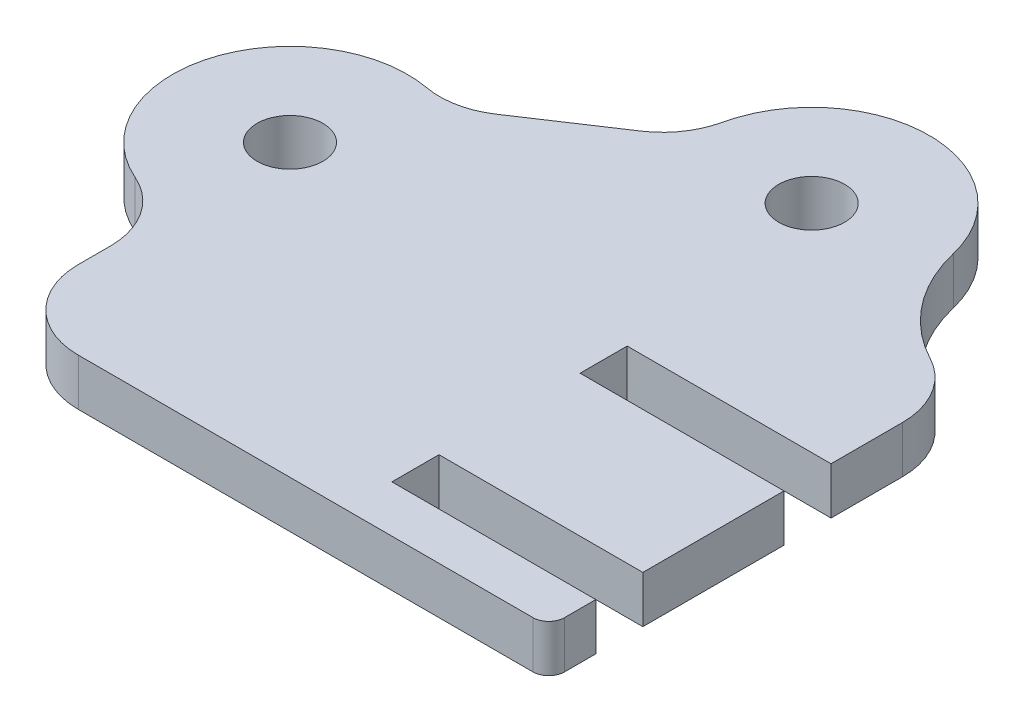
ISO-10303-21;
HEADER;
FILE_DESCRIPTION(('STEP AP214'),'2;1');
FILE_NAME('part.step','',(''),(''),'','','');
FILE_SCHEMA(('AUTOMOTIVE_DESIGN { 1 0 10303 214 1 1 1 1 }'));
ENDSEC;
DATA;
#1=APPLICATION_CONTEXT('core data for automotive mechanical design processes');
#2=APPLICATION_PROTOCOL_DEFINITION('international standard','automotive_design',2000,#1);
#3=PRODUCT_CONTEXT('',#1,'mechanical');
#4=PRODUCT('Part','Part','',(#3));
#5=PRODUCT_RELATED_PRODUCT_CATEGORY('part','',(#4));
#6=PRODUCT_DEFINITION_FORMATION('','',#4);
#7=PRODUCT_DEFINITION_CONTEXT('part definition',#1,'design');
#8=PRODUCT_DEFINITION('design','',#6,#7);
#9=PRODUCT_DEFINITION_SHAPE('','',#8);
#10=(LENGTH_UNIT() NAMED_UNIT(*) SI_UNIT(.MILLI.,.METRE.));
#11=(NAMED_UNIT(*) PLANE_ANGLE_UNIT() SI_UNIT($,.RADIAN.));
#12=(NAMED_UNIT(*) SI_UNIT($,.STERADIAN.) SOLID_ANGLE_UNIT());
#13=UNCERTAINTY_MEASURE_WITH_UNIT(LENGTH_MEASURE(1.E-05),#10,'distance_accuracy_value','');
#14=(GEOMETRIC_REPRESENTATION_CONTEXT(3) GLOBAL_UNCERTAINTY_ASSIGNED_CONTEXT((#13)) GLOBAL_UNIT_ASSIGNED_CONTEXT((#10,
#11,#12)) REPRESENTATION_CONTEXT('',''));
#15=CARTESIAN_POINT('',(0.,0.,0.));
#16=DIRECTION('',(0.,0.,1.));
#17=DIRECTION('',(1.,0.,0.));
#18=AXIS2_PLACEMENT_3D('',#15,#16,#17);
#19=CARTESIAN_POINT('',(2.25395930317418,3.,-12.2951074602719));
#20=DIRECTION('',(0.,-1.,0.));
#21=DIRECTION('',(0.,0.,-1.));
#22=AXIS2_PLACEMENT_3D('',#19,#20,#21);
#23=PLANE('',#22);
#24=DIRECTION('',(1.,0.,0.));
#25=VECTOR('',#24,1.);
#26=CARTESIAN_POINT('',(0.,3.,18.5));
#27=LINE('',#26,#25);
#28=CARTESIAN_POINT('',(5.,3.,18.5));
#29=VERTEX_POINT('',#28);
#30=CARTESIAN_POINT('',(34.,3.,18.5));
#31=VERTEX_POINT('',#30);
#32=EDGE_CURVE('E277',#29,#31,#27,.T.);
#33=ORIENTED_EDGE('',*,*,#32,.T.);
#34=CARTESIAN_POINT('',(34.,3.,17.5));
#35=DIRECTION('',(0.,-1.,0.));
#36=DIRECTION('',(0.,0.,-1.));
#37=AXIS2_PLACEMENT_3D('',#34,#35,#36);
#38=CIRCLE('',#37,1.);
#39=CARTESIAN_POINT('',(35.,3.,17.5));
#40=VERTEX_POINT('',#39);
#41=EDGE_CURVE('E56',#31,#40,#38,.F.);
#42=ORIENTED_EDGE('',*,*,#41,.T.);
#43=DIRECTION('',(0.,0.,-1.));
#44=VECTOR('',#43,1.);
#45=CARTESIAN_POINT('',(35.,3.,15.5));
#46=LINE('',#45,#44);
#47=CARTESIAN_POINT('',(35.,3.,15.5));
#48=VERTEX_POINT('',#47);
#49=EDGE_CURVE('E203',#40,#48,#46,.T.);
#50=ORIENTED_EDGE('',*,*,#49,.T.);
#51=DIRECTION('',(1.,0.,0.));
#52=VECTOR('',#51,1.);
#53=CARTESIAN_POINT('',(30.,3.,15.5));
#54=LINE('',#53,#52);
#55=CARTESIAN_POINT('',(22.,3.,15.5));
#56=VERTEX_POINT('',#55);
#57=EDGE_CURVE('E236',#56,#48,#54,.T.);
#58=ORIENTED_EDGE('',*,*,#57,.F.);
#59=DIRECTION('',(0.,0.,1.));
#60=VECTOR('',#59,1.);
#61=CARTESIAN_POINT('',(22.,3.,12.5));
#62=LINE('',#61,#60);
#63=CARTESIAN_POINT('',(22.,3.,12.5));
#64=VERTEX_POINT('',#63);
#65=EDGE_CURVE('E245',#64,#56,#62,.T.);
#66=ORIENTED_EDGE('',*,*,#65,.F.);
#67=DIRECTION('',(-1.,0.,0.));
#68=VECTOR('',#67,1.);
#69=CARTESIAN_POINT('',(30.,3.,12.5));
#70=LINE('',#69,#68);
#71=CARTESIAN_POINT('',(35.,3.,12.5));
#72=VERTEX_POINT('',#71);
#73=EDGE_CURVE('E224',#72,#64,#70,.T.);
#74=ORIENTED_EDGE('',*,*,#73,.F.);
#75=DIRECTION('',(0.,0.,-1.));
#76=VECTOR('',#75,1.);
#77=CARTESIAN_POINT('',(35.,3.,3.5));
#78=LINE('',#77,#76);
#79=CARTESIAN_POINT('',(35.,3.,3.5));
#80=VERTEX_POINT('',#79);
#81=EDGE_CURVE('E219',#72,#80,#78,.T.);
#82=ORIENTED_EDGE('',*,*,#81,.T.);
#83=DIRECTION('',(-1.,0.,0.));
#84=VECTOR('',#83,1.);
#85=CARTESIAN_POINT('',(22.,3.,3.5));
#86=LINE('',#85,#84);
#87=CARTESIAN_POINT('',(22.,3.,3.5));
#88=VERTEX_POINT('',#87);
#89=EDGE_CURVE('E185',#80,#88,#86,.T.);
#90=ORIENTED_EDGE('',*,*,#89,.T.);
#91=DIRECTION('',(0.,0.,1.));
#92=VECTOR('',#91,1.);
#93=CARTESIAN_POINT('',(22.,3.,0.500000000000003));
#94=LINE('',#93,#92);
#95=CARTESIAN_POINT('',(22.,3.,0.500000000000003));
#96=VERTEX_POINT('',#95);
#97=EDGE_CURVE('E192',#96,#88,#94,.T.);
#98=ORIENTED_EDGE('',*,*,#97,.F.);
#99=DIRECTION('',(1.,0.,0.));
#100=VECTOR('',#99,1.);
#101=CARTESIAN_POINT('',(22.,3.,0.500000000000002));
#102=LINE('',#101,#100);
#103=CARTESIAN_POINT('',(35.,3.,0.500000000000002));
#104=VERTEX_POINT('',#103);
#105=EDGE_CURVE('E175',#96,#104,#102,.T.);
#106=ORIENTED_EDGE('',*,*,#105,.T.);
#107=DIRECTION('',(0.,0.,-1.));
#108=VECTOR('',#107,1.);
#109=CARTESIAN_POINT('',(35.,3.,-7.21002878365453));
#110=LINE('',#109,#108);
#111=CARTESIAN_POINT('',(35.,3.,-4.06018502734124));
#112=VERTEX_POINT('',#111);
#113=EDGE_CURVE('E184',#104,#112,#110,.T.);
#114=ORIENTED_EDGE('',*,*,#113,.T.);
#115=CARTESIAN_POINT('',(30.,3.,-4.06018502734124));
#116=DIRECTION('',(0.,-1.,0.));
#117=DIRECTION('',(0.,0.,-1.));
#118=AXIS2_PLACEMENT_3D('',#115,#116,#117);
#119=CIRCLE('',#118,5.);
#120=CARTESIAN_POINT('',(32.3419070230953,3.,-8.47781691503592));
#121=VERTEX_POINT('',#120);
#122=EDGE_CURVE('E340',#112,#121,#119,.F.);
#123=ORIENTED_EDGE('',*,*,#122,.T.);
#124=CARTESIAN_POINT('',(37.0257210692859,3.,-17.3130806904253));
#125=DIRECTION('',(0.,-1.,0.));
#126=DIRECTION('',(0.,0.,-1.));
#127=AXIS2_PLACEMENT_3D('',#124,#125,#126);
#128=CIRCLE('',#127,10.);
#129=CARTESIAN_POINT('',(27.2967376011225,3.,-15.0007483881375));
#130=VERTEX_POINT('',#129);
#131=EDGE_CURVE('E331',#121,#130,#128,.T.);
#132=ORIENTED_EDGE('',*,*,#131,.T.);
#133=CARTESIAN_POINT('',(20.,3.,-13.2664991614216));
#134=DIRECTION('',(0.,1.,0.));
#135=DIRECTION('',(0.,0.,1.));
#136=AXIS2_PLACEMENT_3D('',#133,#134,#135);
#137=CIRCLE('',#136,7.5);
#138=CARTESIAN_POINT('',(12.6776997954558,3.,-14.8894346852584));
#139=VERTEX_POINT('',#138);
#140=EDGE_CURVE('E279',#130,#139,#137,.T.);
#141=ORIENTED_EDGE('',*,*,#140,.T.);
#142=CARTESIAN_POINT('',(7.79616632575962,3.,-15.9713917011497));
#143=DIRECTION('',(0.,-1.,0.));
#144=DIRECTION('',(0.,0.,1.));
#145=AXIS2_PLACEMENT_3D('',#142,#143,#144);
#146=CIRCLE('',#145,5.);
#147=CARTESIAN_POINT('',(10.5600203177225,3.,-11.804725034483));
#148=VERTEX_POINT('',#147);
#149=EDGE_CURVE('E281',#139,#148,#146,.T.);
#150=ORIENTED_EDGE('',*,*,#149,.T.);
#151=DIRECTION('',(-0.833333333333334,0.,0.552770798392566));
#152=VECTOR('',#151,1.);
#153=CARTESIAN_POINT('',(5.01781329513701,3.,-8.12844079360527));
#154=LINE('',#153,#152);
#155=CARTESIAN_POINT('',(5.01781329513701,3.,-8.12844079360527));
#156=VERTEX_POINT('',#155);
#157=EDGE_CURVE('E283',#148,#156,#154,.T.);
#158=ORIENTED_EDGE('',*,*,#157,.T.);
#159=CARTESIAN_POINT('',(2.25395930317418,3.,-12.2951074602719));
#160=DIRECTION('',(0.,-1.,0.));
#161=DIRECTION('',(0.,0.,-1.));
#162=AXIS2_PLACEMENT_3D('',#159,#160,#161);
#163=CIRCLE('',#162,5.);
#164=CARTESIAN_POINT('',(1.35237558190451,3.,-7.37706447616316));
#165=VERTEX_POINT('',#164);
#166=EDGE_CURVE('E266',#156,#165,#163,.T.);
#167=ORIENTED_EDGE('',*,*,#166,.T.);
#168=CARTESIAN_POINT('',(0.,3.,0.));
#169=DIRECTION('',(0.,1.,0.));
#170=DIRECTION('',(0.,0.,1.));
#171=AXIS2_PLACEMENT_3D('',#168,#169,#170);
#172=CIRCLE('',#171,7.5);
#173=CARTESIAN_POINT('',(-3.,3.,6.87386354243376));
#174=VERTEX_POINT('',#173);
#175=EDGE_CURVE('E269',#165,#174,#172,.T.);
#176=ORIENTED_EDGE('',*,*,#175,.T.);
#177=CARTESIAN_POINT('',(-5.,3.,11.4564392373896));
#178=DIRECTION('',(0.,-1.,0.));
#179=DIRECTION('',(0.,0.,1.));
#180=AXIS2_PLACEMENT_3D('',#177,#178,#179);
#181=CIRCLE('',#180,5.);
#182=CARTESIAN_POINT('',(0.,3.,11.4564392373896));
#183=VERTEX_POINT('',#182);
#184=EDGE_CURVE('E272',#174,#183,#181,.T.);
#185=ORIENTED_EDGE('',*,*,#184,.T.);
#186=DIRECTION('',(0.,0.,1.));
#187=VECTOR('',#186,1.);
#188=CARTESIAN_POINT('',(0.,3.,11.4564392373896));
#189=LINE('',#188,#187);
#190=CARTESIAN_POINT('',(0.,3.,13.5));
#191=VERTEX_POINT('',#190);
#192=EDGE_CURVE('E274',#183,#191,#189,.T.);
#193=ORIENTED_EDGE('',*,*,#192,.T.);
#194=CARTESIAN_POINT('',(5.,3.,13.5));
#195=DIRECTION('',(0.,-1.,0.));
#196=DIRECTION('',(0.,0.,-1.));
#197=AXIS2_PLACEMENT_3D('',#194,#195,#196);
#198=CIRCLE('',#197,5.);
#199=EDGE_CURVE('E327',#191,#29,#198,.F.);
#200=ORIENTED_EDGE('',*,*,#199,.T.);
#201=EDGE_LOOP('',(#33,#42,#50,#58,#66,#74,#82,#90,#98,#106,#114,#123,#132,#141,#150,#158,#167,
#176,#185,#193,#200));
#202=FACE_BOUND('',#201,.T.);
#203=CARTESIAN_POINT('',(0.,3.,0.));
#204=DIRECTION('',(0.,1.,0.));
#205=DIRECTION('',(0.,0.,1.));
#206=AXIS2_PLACEMENT_3D('',#203,#204,#205);
#207=CIRCLE('',#206,2.1);
#208=CARTESIAN_POINT('',(0.,3.,2.1));
#209=VERTEX_POINT('',#208);
#210=EDGE_CURVE('E260',#209,#209,#207,.T.);
#211=ORIENTED_EDGE('',*,*,#210,.F.);
#212=EDGE_LOOP('',(#211));
#213=FACE_BOUND('',#212,.T.);
#214=CARTESIAN_POINT('',(20.,3.,-13.2664991614216));
#215=DIRECTION('',(0.,1.,0.));
#216=DIRECTION('',(0.,0.,1.));
#217=AXIS2_PLACEMENT_3D('',#214,#215,#216);
#218=CIRCLE('',#217,2.1);
#219=CARTESIAN_POINT('',(20.,3.,-11.1664991614216));
#220=VERTEX_POINT('',#219);
#221=EDGE_CURVE('E254',#220,#220,#218,.T.);
#222=ORIENTED_EDGE('',*,*,#221,.F.);
#223=EDGE_LOOP('',(#222));
#224=FACE_BOUND('',#223,.T.);
#225=ADVANCED_FACE('F34',(#202,#213,#224),#23,.F.);
#226=CARTESIAN_POINT('',(2.25395930317418,0.,-12.2951074602719));
#227=DIRECTION('',(0.,-1.,0.));
#228=DIRECTION('',(0.,0.,-1.));
#229=AXIS2_PLACEMENT_3D('',#226,#227,#228);
#230=PLANE('',#229);
#231=DIRECTION('',(0.,0.,-1.));
#232=VECTOR('',#231,1.);
#233=CARTESIAN_POINT('',(35.,0.,15.5));
#234=LINE('',#233,#232);
#235=CARTESIAN_POINT('',(35.,0.,17.5));
#236=VERTEX_POINT('',#235);
#237=CARTESIAN_POINT('',(35.,0.,15.5));
#238=VERTEX_POINT('',#237);
#239=EDGE_CURVE('E205',#236,#238,#234,.T.);
#240=ORIENTED_EDGE('',*,*,#239,.F.);
#241=CARTESIAN_POINT('',(34.,0.,17.5));
#242=DIRECTION('',(0.,-1.,0.));
#243=DIRECTION('',(0.,0.,-1.));
#244=AXIS2_PLACEMENT_3D('',#241,#242,#243);
#245=CIRCLE('',#244,1.);
#246=CARTESIAN_POINT('',(34.,0.,18.5));
#247=VERTEX_POINT('',#246);
#248=EDGE_CURVE('E11',#236,#247,#245,.T.);
#249=ORIENTED_EDGE('',*,*,#248,.T.);
#250=DIRECTION('',(1.,0.,0.));
#251=VECTOR('',#250,1.);
#252=CARTESIAN_POINT('',(0.,0.,18.5));
#253=LINE('',#252,#251);
#254=CARTESIAN_POINT('',(5.,0.,18.5));
#255=VERTEX_POINT('',#254);
#256=EDGE_CURVE('E295',#255,#247,#253,.T.);
#257=ORIENTED_EDGE('',*,*,#256,.F.);
#258=CARTESIAN_POINT('',(5.,0.,13.5));
#259=DIRECTION('',(0.,-1.,0.));
#260=DIRECTION('',(0.,0.,-1.));
#261=AXIS2_PLACEMENT_3D('',#258,#259,#260);
#262=CIRCLE('',#261,5.);
#263=CARTESIAN_POINT('',(0.,0.,13.5));
#264=VERTEX_POINT('',#263);
#265=EDGE_CURVE('E323',#255,#264,#262,.T.);
#266=ORIENTED_EDGE('',*,*,#265,.T.);
#267=DIRECTION('',(0.,0.,1.));
#268=VECTOR('',#267,1.);
#269=CARTESIAN_POINT('',(0.,0.,11.4564392373896));
#270=LINE('',#269,#268);
#271=CARTESIAN_POINT('',(0.,0.,11.4564392373896));
#272=VERTEX_POINT('',#271);
#273=EDGE_CURVE('E292',#272,#264,#270,.T.);
#274=ORIENTED_EDGE('',*,*,#273,.F.);
#275=CARTESIAN_POINT('',(-5.,0.,11.4564392373896));
#276=DIRECTION('',(0.,-1.,0.));
#277=DIRECTION('',(0.,0.,1.));
#278=AXIS2_PLACEMENT_3D('',#275,#276,#277);
#279=CIRCLE('',#278,5.);
#280=CARTESIAN_POINT('',(-3.,0.,6.87386354243376));
#281=VERTEX_POINT('',#280);
#282=EDGE_CURVE('E290',#281,#272,#279,.T.);
#283=ORIENTED_EDGE('',*,*,#282,.F.);
#284=CARTESIAN_POINT('',(0.,0.,0.));
#285=DIRECTION('',(0.,1.,0.));
#286=DIRECTION('',(0.,0.,1.));
#287=AXIS2_PLACEMENT_3D('',#284,#285,#286);
#288=CIRCLE('',#287,7.5);
#289=CARTESIAN_POINT('',(1.35237558190451,0.,-7.37706447616316));
#290=VERTEX_POINT('',#289);
#291=EDGE_CURVE('E288',#290,#281,#288,.T.);
#292=ORIENTED_EDGE('',*,*,#291,.F.);
#293=CARTESIAN_POINT('',(2.25395930317418,0.,-12.2951074602719));
#294=DIRECTION('',(0.,-1.,0.));
#295=DIRECTION('',(0.,0.,-1.));
#296=AXIS2_PLACEMENT_3D('',#293,#294,#295);
#297=CIRCLE('',#296,5.);
#298=CARTESIAN_POINT('',(5.01781329513701,0.,-8.12844079360527));
#299=VERTEX_POINT('',#298);
#300=EDGE_CURVE('E263',#299,#290,#297,.T.);
#301=ORIENTED_EDGE('',*,*,#300,.F.);
#302=DIRECTION('',(-0.833333333333334,0.,0.552770798392566));
#303=VECTOR('',#302,1.);
#304=CARTESIAN_POINT('',(5.01781329513701,0.,-8.12844079360527));
#305=LINE('',#304,#303);
#306=CARTESIAN_POINT('',(10.5600203177225,0.,-11.804725034483));
#307=VERTEX_POINT('',#306);
#308=EDGE_CURVE('E270',#307,#299,#305,.T.);
#309=ORIENTED_EDGE('',*,*,#308,.F.);
#310=CARTESIAN_POINT('',(7.79616632575962,0.,-15.9713917011497));
#311=DIRECTION('',(0.,-1.,0.));
#312=DIRECTION('',(0.,0.,1.));
#313=AXIS2_PLACEMENT_3D('',#310,#311,#312);
#314=CIRCLE('',#313,5.);
#315=CARTESIAN_POINT('',(12.6776997954558,0.,-14.8894346852584));
#316=VERTEX_POINT('',#315);
#317=EDGE_CURVE('E300',#316,#307,#314,.T.);
#318=ORIENTED_EDGE('',*,*,#317,.F.);
#319=CARTESIAN_POINT('',(20.,0.,-13.2664991614216));
#320=DIRECTION('',(0.,1.,0.));
#321=DIRECTION('',(0.,0.,1.));
#322=AXIS2_PLACEMENT_3D('',#319,#320,#321);
#323=CIRCLE('',#322,7.5);
#324=CARTESIAN_POINT('',(27.2967376011225,0.,-15.0007483881375));
#325=VERTEX_POINT('',#324);
#326=EDGE_CURVE('E298',#325,#316,#323,.T.);
#327=ORIENTED_EDGE('',*,*,#326,.F.);
#328=CARTESIAN_POINT('',(37.0257210692859,0.,-17.3130806904253));
#329=DIRECTION('',(0.,-1.,0.));
#330=DIRECTION('',(0.,0.,-1.));
#331=AXIS2_PLACEMENT_3D('',#328,#329,#330);
#332=CIRCLE('',#331,10.);
#333=CARTESIAN_POINT('',(32.3419070230953,0.,-8.47781691503592));
#334=VERTEX_POINT('',#333);
#335=EDGE_CURVE('E333',#325,#334,#332,.F.);
#336=ORIENTED_EDGE('',*,*,#335,.T.);
#337=CARTESIAN_POINT('',(30.,0.,-4.06018502734124));
#338=DIRECTION('',(0.,-1.,0.));
#339=DIRECTION('',(0.,0.,-1.));
#340=AXIS2_PLACEMENT_3D('',#337,#338,#339);
#341=CIRCLE('',#340,5.);
#342=CARTESIAN_POINT('',(35.,0.,-4.06018502734124));
#343=VERTEX_POINT('',#342);
#344=EDGE_CURVE('E344',#334,#343,#341,.T.);
#345=ORIENTED_EDGE('',*,*,#344,.T.);
#346=DIRECTION('',(0.,0.,-1.));
#347=VECTOR('',#346,1.);
#348=CARTESIAN_POINT('',(35.,0.,-7.21002878365453));
#349=LINE('',#348,#347);
#350=CARTESIAN_POINT('',(35.,0.,0.500000000000002));
#351=VERTEX_POINT('',#350);
#352=EDGE_CURVE('E214',#351,#343,#349,.T.);
#353=ORIENTED_EDGE('',*,*,#352,.F.);
#354=DIRECTION('',(1.,0.,0.));
#355=VECTOR('',#354,1.);
#356=CARTESIAN_POINT('',(22.,0.,0.500000000000002));
#357=LINE('',#356,#355);
#358=CARTESIAN_POINT('',(22.,0.,0.500000000000003));
#359=VERTEX_POINT('',#358);
#360=EDGE_CURVE('E212',#359,#351,#357,.T.);
#361=ORIENTED_EDGE('',*,*,#360,.F.);
#362=DIRECTION('',(0.,0.,-1.));
#363=VECTOR('',#362,1.);
#364=CARTESIAN_POINT('',(22.,0.,-12.2951074602719));
#365=LINE('',#364,#363);
#366=CARTESIAN_POINT('',(22.,0.,3.5));
#367=VERTEX_POINT('',#366);
#368=EDGE_CURVE('E194',#367,#359,#365,.T.);
#369=ORIENTED_EDGE('',*,*,#368,.F.);
#370=DIRECTION('',(-1.,0.,0.));
#371=VECTOR('',#370,1.);
#372=CARTESIAN_POINT('',(22.,0.,3.5));
#373=LINE('',#372,#371);
#374=CARTESIAN_POINT('',(35.,0.,3.5));
#375=VERTEX_POINT('',#374);
#376=EDGE_CURVE('E210',#375,#367,#373,.T.);
#377=ORIENTED_EDGE('',*,*,#376,.F.);
#378=DIRECTION('',(0.,0.,-1.));
#379=VECTOR('',#378,1.);
#380=CARTESIAN_POINT('',(35.,0.,3.5));
#381=LINE('',#380,#379);
#382=CARTESIAN_POINT('',(35.,0.,12.5));
#383=VERTEX_POINT('',#382);
#384=EDGE_CURVE('E207',#383,#375,#381,.T.);
#385=ORIENTED_EDGE('',*,*,#384,.F.);
#386=DIRECTION('',(-1.,0.,0.));
#387=VECTOR('',#386,1.);
#388=CARTESIAN_POINT('',(30.,0.,12.5));
#389=LINE('',#388,#387);
#390=CARTESIAN_POINT('',(22.,0.,12.5));
#391=VERTEX_POINT('',#390);
#392=EDGE_CURVE('E232',#383,#391,#389,.T.);
#393=ORIENTED_EDGE('',*,*,#392,.T.);
#394=DIRECTION('',(0.,0.,1.));
#395=VECTOR('',#394,1.);
#396=CARTESIAN_POINT('',(22.,0.,12.5));
#397=LINE('',#396,#395);
#398=CARTESIAN_POINT('',(22.,0.,15.5));
#399=VERTEX_POINT('',#398);
#400=EDGE_CURVE('E235',#391,#399,#397,.T.);
#401=ORIENTED_EDGE('',*,*,#400,.T.);
#402=DIRECTION('',(1.,0.,0.));
#403=VECTOR('',#402,1.);
#404=CARTESIAN_POINT('',(30.,0.,15.5));
#405=LINE('',#404,#403);
#406=EDGE_CURVE('E239',#399,#238,#405,.T.);
#407=ORIENTED_EDGE('',*,*,#406,.T.);
#408=EDGE_LOOP('',(#240,#249,#257,#266,#274,#283,#292,#301,#309,#318,#327,#336,#345,#353,#361,
#369,#377,#385,#393,#401,#407));
#409=FACE_BOUND('',#408,.T.);
#410=CARTESIAN_POINT('',(0.,0.,0.));
#411=DIRECTION('',(0.,1.,0.));
#412=DIRECTION('',(0.,0.,1.));
#413=AXIS2_PLACEMENT_3D('',#410,#411,#412);
#414=CIRCLE('',#413,2.1);
#415=CARTESIAN_POINT('',(0.,0.,2.1));
#416=VERTEX_POINT('',#415);
#417=EDGE_CURVE('E257',#416,#416,#414,.T.);
#418=ORIENTED_EDGE('',*,*,#417,.T.);
#419=EDGE_LOOP('',(#418));
#420=FACE_BOUND('',#419,.T.);
#421=CARTESIAN_POINT('',(20.,0.,-13.2664991614216));
#422=DIRECTION('',(0.,1.,0.));
#423=DIRECTION('',(0.,0.,1.));
#424=AXIS2_PLACEMENT_3D('',#421,#422,#423);
#425=CIRCLE('',#424,2.1);
#426=CARTESIAN_POINT('',(20.,0.,-11.1664991614216));
#427=VERTEX_POINT('',#426);
#428=EDGE_CURVE('E252',#427,#427,#425,.T.);
#429=ORIENTED_EDGE('',*,*,#428,.T.);
#430=EDGE_LOOP('',(#429));
#431=FACE_BOUND('',#430,.T.);
#432=ADVANCED_FACE('F363',(#409,#420,#431),#230,.T.);
#433=CARTESIAN_POINT('',(2.25395930317418,3.,-12.2951074602719));
#434=DIRECTION('',(0.,-1.,0.));
#435=DIRECTION('',(0.,0.,-1.));
#436=AXIS2_PLACEMENT_3D('',#433,#434,#435);
#437=CYLINDRICAL_SURFACE('',#436,5.);
#438=ORIENTED_EDGE('',*,*,#300,.T.);
#439=DIRECTION('',(0.,-1.,0.));
#440=VECTOR('',#439,1.);
#441=CARTESIAN_POINT('',(1.35237558190451,3.,-7.37706447616316));
#442=LINE('',#441,#440);
#443=EDGE_CURVE('E317',#165,#290,#442,.T.);
#444=ORIENTED_EDGE('',*,*,#443,.F.);
#445=ORIENTED_EDGE('',*,*,#166,.F.);
#446=DIRECTION('',(0.,-1.,0.));
#447=VECTOR('',#446,1.);
#448=CARTESIAN_POINT('',(5.01781329513701,3.,-8.12844079360527));
#449=LINE('',#448,#447);
#450=EDGE_CURVE('E285',#156,#299,#449,.T.);
#451=ORIENTED_EDGE('',*,*,#450,.T.);
#452=EDGE_LOOP('',(#438,#444,#445,#451));
#453=FACE_BOUND('',#452,.T.);
#454=ADVANCED_FACE('F378',(#453),#437,.F.);
#455=CARTESIAN_POINT('',(0.,3.,0.));
#456=DIRECTION('',(0.,-1.,0.));
#457=DIRECTION('',(0.,0.,-1.));
#458=AXIS2_PLACEMENT_3D('',#455,#456,#457);
#459=CYLINDRICAL_SURFACE('',#458,7.5);
#460=ORIENTED_EDGE('',*,*,#291,.T.);
#461=DIRECTION('',(0.,-1.,0.));
#462=VECTOR('',#461,1.);
#463=CARTESIAN_POINT('',(-3.,3.,6.87386354243376));
#464=LINE('',#463,#462);
#465=EDGE_CURVE('E314',#174,#281,#464,.T.);
#466=ORIENTED_EDGE('',*,*,#465,.F.);
#467=ORIENTED_EDGE('',*,*,#175,.F.);
#468=ORIENTED_EDGE('',*,*,#443,.T.);
#469=EDGE_LOOP('',(#460,#466,#467,#468));
#470=FACE_BOUND('',#469,.T.);
#471=ADVANCED_FACE('F405',(#470),#459,.T.);
#472=CARTESIAN_POINT('',(-5.,3.,11.4564392373896));
#473=DIRECTION('',(0.,-1.,0.));
#474=DIRECTION('',(0.,0.,-1.));
#475=AXIS2_PLACEMENT_3D('',#472,#473,#474);
#476=CYLINDRICAL_SURFACE('',#475,5.);
#477=ORIENTED_EDGE('',*,*,#282,.T.);
#478=DIRECTION('',(0.,-1.,0.));
#479=VECTOR('',#478,1.);
#480=CARTESIAN_POINT('',(0.,3.,11.4564392373896));
#481=LINE('',#480,#479);
#482=EDGE_CURVE('E311',#183,#272,#481,.T.);
#483=ORIENTED_EDGE('',*,*,#482,.F.);
#484=ORIENTED_EDGE('',*,*,#184,.F.);
#485=ORIENTED_EDGE('',*,*,#465,.T.);
#486=EDGE_LOOP('',(#477,#483,#484,#485));
#487=FACE_BOUND('',#486,.T.);
#488=ADVANCED_FACE('F401',(#487),#476,.F.);
#489=CARTESIAN_POINT('',(0.,3.,11.4564392373896));
#490=DIRECTION('',(1.,0.,0.));
#491=DIRECTION('',(0.,0.,-1.));
#492=AXIS2_PLACEMENT_3D('',#489,#490,#491);
#493=PLANE('',#492);
#494=ORIENTED_EDGE('',*,*,#273,.T.);
#495=DIRECTION('',(0.,-1.,0.));
#496=VECTOR('',#495,1.);
#497=CARTESIAN_POINT('',(0.,3.,13.5));
#498=LINE('',#497,#496);
#499=EDGE_CURVE('E325',#264,#191,#498,.F.);
#500=ORIENTED_EDGE('',*,*,#499,.T.);
#501=ORIENTED_EDGE('',*,*,#192,.F.);
#502=ORIENTED_EDGE('',*,*,#482,.T.);
#503=EDGE_LOOP('',(#494,#500,#501,#502));
#504=FACE_BOUND('',#503,.T.);
#505=ADVANCED_FACE('F398',(#504),#493,.F.);
#506=CARTESIAN_POINT('',(0.,3.,18.5));
#507=DIRECTION('',(0.,0.,-1.));
#508=DIRECTION('',(-1.,0.,0.));
#509=AXIS2_PLACEMENT_3D('',#506,#507,#508);
#510=PLANE('',#509);
#511=ORIENTED_EDGE('',*,*,#256,.T.);
#512=DIRECTION('',(0.,1.,0.));
#513=VECTOR('',#512,1.);
#514=CARTESIAN_POINT('',(34.,3.,18.5));
#515=LINE('',#514,#513);
#516=EDGE_CURVE('E346',#247,#31,#515,.T.);
#517=ORIENTED_EDGE('',*,*,#516,.T.);
#518=ORIENTED_EDGE('',*,*,#32,.F.);
#519=DIRECTION('',(0.,-1.,0.));
#520=VECTOR('',#519,1.);
#521=CARTESIAN_POINT('',(5.,3.,18.5));
#522=LINE('',#521,#520);
#523=EDGE_CURVE('E320',#29,#255,#522,.T.);
#524=ORIENTED_EDGE('',*,*,#523,.T.);
#525=EDGE_LOOP('',(#511,#517,#518,#524));
#526=FACE_BOUND('',#525,.T.);
#527=ADVANCED_FACE('F352',(#526),#510,.F.);
#528=CARTESIAN_POINT('',(20.,3.,-13.2664991614216));
#529=DIRECTION('',(0.,-1.,0.));
#530=DIRECTION('',(0.,0.,-1.));
#531=AXIS2_PLACEMENT_3D('',#528,#529,#530);
#532=CYLINDRICAL_SURFACE('',#531,7.5);
#533=ORIENTED_EDGE('',*,*,#140,.F.);
#534=DIRECTION('',(0.,-1.,0.));
#535=VECTOR('',#534,1.);
#536=CARTESIAN_POINT('',(27.2967376011225,3.,-15.0007483881375));
#537=LINE('',#536,#535);
#538=EDGE_CURVE('E329',#130,#325,#537,.T.);
#539=ORIENTED_EDGE('',*,*,#538,.T.);
#540=ORIENTED_EDGE('',*,*,#326,.T.);
#541=DIRECTION('',(0.,-1.,0.));
#542=VECTOR('',#541,1.);
#543=CARTESIAN_POINT('',(12.6776997954558,3.,-14.8894346852584));
#544=LINE('',#543,#542);
#545=EDGE_CURVE('E308',#139,#316,#544,.T.);
#546=ORIENTED_EDGE('',*,*,#545,.F.);
#547=EDGE_LOOP('',(#533,#539,#540,#546));
#548=FACE_BOUND('',#547,.T.);
#549=ADVANCED_FACE('F391',(#548),#532,.T.);
#550=CARTESIAN_POINT('',(7.79616632575962,3.,-15.9713917011497));
#551=DIRECTION('',(0.,-1.,0.));
#552=DIRECTION('',(0.,0.,-1.));
#553=AXIS2_PLACEMENT_3D('',#550,#551,#552);
#554=CYLINDRICAL_SURFACE('',#553,5.);
#555=ORIENTED_EDGE('',*,*,#317,.T.);
#556=DIRECTION('',(0.,-1.,0.));
#557=VECTOR('',#556,1.);
#558=CARTESIAN_POINT('',(10.5600203177225,3.,-11.804725034483));
#559=LINE('',#558,#557);
#560=EDGE_CURVE('E305',#148,#307,#559,.T.);
#561=ORIENTED_EDGE('',*,*,#560,.F.);
#562=ORIENTED_EDGE('',*,*,#149,.F.);
#563=ORIENTED_EDGE('',*,*,#545,.T.);
#564=EDGE_LOOP('',(#555,#561,#562,#563));
#565=FACE_BOUND('',#564,.T.);
#566=ADVANCED_FACE('F387',(#565),#554,.F.);
#567=CARTESIAN_POINT('',(5.01781329513701,3.,-8.12844079360527));
#568=DIRECTION('',(0.552770798392566,0.,0.833333333333333));
#569=DIRECTION('',(0.833333333333334,0.,-0.552770798392566));
#570=AXIS2_PLACEMENT_3D('',#567,#568,#569);
#571=PLANE('',#570);
#572=ORIENTED_EDGE('',*,*,#308,.T.);
#573=ORIENTED_EDGE('',*,*,#450,.F.);
#574=ORIENTED_EDGE('',*,*,#157,.F.);
#575=ORIENTED_EDGE('',*,*,#560,.T.);
#576=EDGE_LOOP('',(#572,#573,#574,#575));
#577=FACE_BOUND('',#576,.T.);
#578=ADVANCED_FACE('F384',(#577),#571,.F.);
#579=CARTESIAN_POINT('',(0.,3.,0.));
#580=DIRECTION('',(0.,-1.,0.));
#581=DIRECTION('',(0.,0.,-1.));
#582=AXIS2_PLACEMENT_3D('',#579,#580,#581);
#583=CYLINDRICAL_SURFACE('',#582,2.1);
#584=ORIENTED_EDGE('',*,*,#210,.T.);
#585=EDGE_LOOP('',(#584));
#586=FACE_BOUND('',#585,.T.);
#587=ORIENTED_EDGE('',*,*,#417,.F.);
#588=EDGE_LOOP('',(#587));
#589=FACE_BOUND('',#588,.T.);
#590=ADVANCED_FACE('F381',(#586,#589),#583,.F.);
#591=CARTESIAN_POINT('',(20.,3.,-13.2664991614216));
#592=DIRECTION('',(0.,-1.,0.));
#593=DIRECTION('',(0.,0.,-1.));
#594=AXIS2_PLACEMENT_3D('',#591,#592,#593);
#595=CYLINDRICAL_SURFACE('',#594,2.1);
#596=ORIENTED_EDGE('',*,*,#221,.T.);
#597=EDGE_LOOP('',(#596));
#598=FACE_BOUND('',#597,.T.);
#599=ORIENTED_EDGE('',*,*,#428,.F.);
#600=EDGE_LOOP('',(#599));
#601=FACE_BOUND('',#600,.T.);
#602=ADVANCED_FACE('F416',(#598,#601),#595,.F.);
#603=CARTESIAN_POINT('',(5.,3.,13.5));
#604=DIRECTION('',(0.,-1.,0.));
#605=DIRECTION('',(0.,0.,-1.));
#606=AXIS2_PLACEMENT_3D('',#603,#604,#605);
#607=CYLINDRICAL_SURFACE('',#606,5.);
#608=ORIENTED_EDGE('',*,*,#199,.F.);
#609=ORIENTED_EDGE('',*,*,#499,.F.);
#610=ORIENTED_EDGE('',*,*,#265,.F.);
#611=ORIENTED_EDGE('',*,*,#523,.F.);
#612=EDGE_LOOP('',(#608,#609,#610,#611));
#613=FACE_BOUND('',#612,.T.);
#614=ADVANCED_FACE('F361',(#613),#607,.T.);
#615=CARTESIAN_POINT('',(30.,0.,15.5));
#616=DIRECTION('',(0.,0.,1.));
#617=DIRECTION('',(1.,0.,0.));
#618=AXIS2_PLACEMENT_3D('',#615,#616,#617);
#619=PLANE('',#618);
#620=ORIENTED_EDGE('',*,*,#57,.T.);
#621=DIRECTION('',(0.,1.,0.));
#622=VECTOR('',#621,1.);
#623=CARTESIAN_POINT('',(35.,0.,15.5));
#624=LINE('',#623,#622);
#625=EDGE_CURVE('E217',#238,#48,#624,.T.);
#626=ORIENTED_EDGE('',*,*,#625,.F.);
#627=ORIENTED_EDGE('',*,*,#406,.F.);
#628=DIRECTION('',(0.,1.,0.));
#629=VECTOR('',#628,1.);
#630=CARTESIAN_POINT('',(22.,0.,15.5));
#631=LINE('',#630,#629);
#632=EDGE_CURVE('E250',#399,#56,#631,.T.);
#633=ORIENTED_EDGE('',*,*,#632,.T.);
#634=EDGE_LOOP('',(#620,#626,#627,#633));
#635=FACE_BOUND('',#634,.T.);
#636=ADVANCED_FACE('F415',(#635),#619,.F.);
#637=CARTESIAN_POINT('',(22.,0.,12.5));
#638=DIRECTION('',(-1.,0.,0.));
#639=DIRECTION('',(0.,0.,1.));
#640=AXIS2_PLACEMENT_3D('',#637,#638,#639);
#641=PLANE('',#640);
#642=ORIENTED_EDGE('',*,*,#65,.T.);
#643=ORIENTED_EDGE('',*,*,#632,.F.);
#644=ORIENTED_EDGE('',*,*,#400,.F.);
#645=DIRECTION('',(0.,1.,0.));
#646=VECTOR('',#645,1.);
#647=CARTESIAN_POINT('',(22.,0.,12.5));
#648=LINE('',#647,#646);
#649=EDGE_CURVE('E242',#391,#64,#648,.T.);
#650=ORIENTED_EDGE('',*,*,#649,.T.);
#651=EDGE_LOOP('',(#642,#643,#644,#650));
#652=FACE_BOUND('',#651,.T.);
#653=ADVANCED_FACE('F449',(#652),#641,.F.);
#654=CARTESIAN_POINT('',(30.,0.,12.5));
#655=DIRECTION('',(0.,0.,-1.));
#656=DIRECTION('',(-1.,0.,0.));
#657=AXIS2_PLACEMENT_3D('',#654,#655,#656);
#658=PLANE('',#657);
#659=ORIENTED_EDGE('',*,*,#73,.T.);
#660=ORIENTED_EDGE('',*,*,#649,.F.);
#661=ORIENTED_EDGE('',*,*,#392,.F.);
#662=DIRECTION('',(0.,1.,0.));
#663=VECTOR('',#662,1.);
#664=CARTESIAN_POINT('',(35.,0.,12.5));
#665=LINE('',#664,#663);
#666=EDGE_CURVE('E227',#383,#72,#665,.T.);
#667=ORIENTED_EDGE('',*,*,#666,.T.);
#668=EDGE_LOOP('',(#659,#660,#661,#667));
#669=FACE_BOUND('',#668,.T.);
#670=ADVANCED_FACE('F440',(#669),#658,.F.);
#671=CARTESIAN_POINT('',(35.,0.,-7.21002878365453));
#672=DIRECTION('',(1.,0.,0.));
#673=DIRECTION('',(0.,0.,-1.));
#674=AXIS2_PLACEMENT_3D('',#671,#672,#673);
#675=PLANE('',#674);
#676=ORIENTED_EDGE('',*,*,#352,.T.);
#677=DIRECTION('',(0.,1.,0.));
#678=VECTOR('',#677,1.);
#679=CARTESIAN_POINT('',(35.,3.,-4.06018502734124));
#680=LINE('',#679,#678);
#681=EDGE_CURVE('E337',#343,#112,#680,.T.);
#682=ORIENTED_EDGE('',*,*,#681,.T.);
#683=ORIENTED_EDGE('',*,*,#113,.F.);
#684=DIRECTION('',(0.,1.,0.));
#685=VECTOR('',#684,1.);
#686=CARTESIAN_POINT('',(35.,0.,0.500000000000002));
#687=LINE('',#686,#685);
#688=EDGE_CURVE('E180',#351,#104,#687,.T.);
#689=ORIENTED_EDGE('',*,*,#688,.F.);
#690=EDGE_LOOP('',(#676,#682,#683,#689));
#691=FACE_BOUND('',#690,.T.);
#692=ADVANCED_FACE('F439',(#691),#675,.T.);
#693=CARTESIAN_POINT('',(22.,0.,0.500000000000002));
#694=DIRECTION('',(0.,0.,1.));
#695=DIRECTION('',(1.,0.,0.));
#696=AXIS2_PLACEMENT_3D('',#693,#694,#695);
#697=PLANE('',#696);
#698=ORIENTED_EDGE('',*,*,#105,.F.);
#699=DIRECTION('',(0.,1.,0.));
#700=VECTOR('',#699,1.);
#701=CARTESIAN_POINT('',(22.,-0.5,0.500000000000003));
#702=LINE('',#701,#700);
#703=EDGE_CURVE('E178',#359,#96,#702,.T.);
#704=ORIENTED_EDGE('',*,*,#703,.F.);
#705=ORIENTED_EDGE('',*,*,#360,.T.);
#706=ORIENTED_EDGE('',*,*,#688,.T.);
#707=EDGE_LOOP('',(#698,#704,#705,#706));
#708=FACE_BOUND('',#707,.T.);
#709=ADVANCED_FACE('F177',(#708),#697,.T.);
#710=CARTESIAN_POINT('',(35.,0.,3.5));
#711=DIRECTION('',(1.,0.,0.));
#712=DIRECTION('',(0.,0.,-1.));
#713=AXIS2_PLACEMENT_3D('',#710,#711,#712);
#714=PLANE('',#713);
#715=ORIENTED_EDGE('',*,*,#81,.F.);
#716=ORIENTED_EDGE('',*,*,#666,.F.);
#717=ORIENTED_EDGE('',*,*,#384,.T.);
#718=DIRECTION('',(0.,1.,0.));
#719=VECTOR('',#718,1.);
#720=CARTESIAN_POINT('',(35.,0.,3.5));
#721=LINE('',#720,#719);
#722=EDGE_CURVE('E225',#375,#80,#721,.T.);
#723=ORIENTED_EDGE('',*,*,#722,.T.);
#724=EDGE_LOOP('',(#715,#716,#717,#723));
#725=FACE_BOUND('',#724,.T.);
#726=ADVANCED_FACE('F446',(#725),#714,.T.);
#727=CARTESIAN_POINT('',(22.,0.,3.5));
#728=DIRECTION('',(0.,0.,-1.));
#729=DIRECTION('',(-1.,0.,0.));
#730=AXIS2_PLACEMENT_3D('',#727,#728,#729);
#731=PLANE('',#730);
#732=ORIENTED_EDGE('',*,*,#376,.T.);
#733=DIRECTION('',(0.,1.,0.));
#734=VECTOR('',#733,1.);
#735=CARTESIAN_POINT('',(22.,-0.5,3.5));
#736=LINE('',#735,#734);
#737=EDGE_CURVE('E195',#367,#88,#736,.T.);
#738=ORIENTED_EDGE('',*,*,#737,.T.);
#739=ORIENTED_EDGE('',*,*,#89,.F.);
#740=ORIENTED_EDGE('',*,*,#722,.F.);
#741=EDGE_LOOP('',(#732,#738,#739,#740));
#742=FACE_BOUND('',#741,.T.);
#743=ADVANCED_FACE('F427',(#742),#731,.T.);
#744=CARTESIAN_POINT('',(35.,0.,15.5));
#745=DIRECTION('',(1.,0.,0.));
#746=DIRECTION('',(0.,0.,-1.));
#747=AXIS2_PLACEMENT_3D('',#744,#745,#746);
#748=PLANE('',#747);
#749=ORIENTED_EDGE('',*,*,#49,.F.);
#750=DIRECTION('',(0.,1.,0.));
#751=VECTOR('',#750,1.);
#752=CARTESIAN_POINT('',(35.,0.,17.5));
#753=LINE('',#752,#751);
#754=EDGE_CURVE('E42',#40,#236,#753,.F.);
#755=ORIENTED_EDGE('',*,*,#754,.T.);
#756=ORIENTED_EDGE('',*,*,#239,.T.);
#757=ORIENTED_EDGE('',*,*,#625,.T.);
#758=EDGE_LOOP('',(#749,#755,#756,#757));
#759=FACE_BOUND('',#758,.T.);
#760=ADVANCED_FACE('F419',(#759),#748,.T.);
#761=CARTESIAN_POINT('',(37.0257210692859,3.,-17.3130806904253));
#762=DIRECTION('',(0.,-1.,0.));
#763=DIRECTION('',(0.,0.,-1.));
#764=AXIS2_PLACEMENT_3D('',#761,#762,#763);
#765=CYLINDRICAL_SURFACE('',#764,10.);
#766=ORIENTED_EDGE('',*,*,#131,.F.);
#767=DIRECTION('',(0.,-1.,0.));
#768=VECTOR('',#767,1.);
#769=CARTESIAN_POINT('',(32.3419070230953,3.,-8.47781691503592));
#770=LINE('',#769,#768);
#771=EDGE_CURVE('E342',#121,#334,#770,.T.);
#772=ORIENTED_EDGE('',*,*,#771,.T.);
#773=ORIENTED_EDGE('',*,*,#335,.F.);
#774=ORIENTED_EDGE('',*,*,#538,.F.);
#775=EDGE_LOOP('',(#766,#772,#773,#774));
#776=FACE_BOUND('',#775,.T.);
#777=ADVANCED_FACE('F417',(#776),#765,.F.);
#778=CARTESIAN_POINT('',(22.,-0.5,0.500000000000003));
#779=DIRECTION('',(-1.,0.,0.));
#780=DIRECTION('',(0.,0.,1.));
#781=AXIS2_PLACEMENT_3D('',#778,#779,#780);
#782=PLANE('',#781);
#783=ORIENTED_EDGE('',*,*,#368,.T.);
#784=ORIENTED_EDGE('',*,*,#703,.T.);
#785=ORIENTED_EDGE('',*,*,#97,.T.);
#786=ORIENTED_EDGE('',*,*,#737,.F.);
#787=EDGE_LOOP('',(#783,#784,#785,#786));
#788=FACE_BOUND('',#787,.T.);
#789=ADVANCED_FACE('F190',(#788),#782,.F.);
#790=CARTESIAN_POINT('',(30.,3.,-4.06018502734124));
#791=DIRECTION('',(0.,-1.,0.));
#792=DIRECTION('',(0.,0.,-1.));
#793=AXIS2_PLACEMENT_3D('',#790,#791,#792);
#794=CYLINDRICAL_SURFACE('',#793,5.);
#795=ORIENTED_EDGE('',*,*,#344,.F.);
#796=ORIENTED_EDGE('',*,*,#771,.F.);
#797=ORIENTED_EDGE('',*,*,#122,.F.);
#798=ORIENTED_EDGE('',*,*,#681,.F.);
#799=EDGE_LOOP('',(#795,#796,#797,#798));
#800=FACE_BOUND('',#799,.T.);
#801=ADVANCED_FACE('F367',(#800),#794,.T.);
#802=CARTESIAN_POINT('',(34.,3.,17.5));
#803=DIRECTION('',(0.,-1.,0.));
#804=DIRECTION('',(0.,0.,-1.));
#805=AXIS2_PLACEMENT_3D('',#802,#803,#804);
#806=CYLINDRICAL_SURFACE('',#805,1.);
#807=ORIENTED_EDGE('',*,*,#248,.F.);
#808=ORIENTED_EDGE('',*,*,#754,.F.);
#809=ORIENTED_EDGE('',*,*,#41,.F.);
#810=ORIENTED_EDGE('',*,*,#516,.F.);
#811=EDGE_LOOP('',(#807,#808,#809,#810));
#812=FACE_BOUND('',#811,.T.);
#813=ADVANCED_FACE('F36',(#812),#806,.T.);
#814=CLOSED_SHELL('',(#225,#432,#454,#471,#488,#505,#527,#549,#566,#578,#590,#602,#614,#636,
#653,#670,#692,#709,#726,#743,#760,#777,#789,#801,#813));
#815=MANIFOLD_SOLID_BREP('B2',#814);
#816=ADVANCED_BREP_SHAPE_REPRESENTATION('',(#18,#815),#14);
#817=SHAPE_DEFINITION_REPRESENTATION(#9,#816);
ENDSEC;
END-ISO-10303-21;
